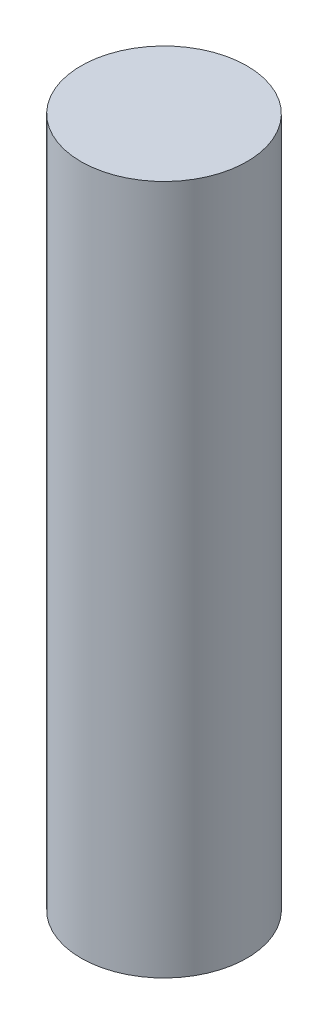
ISO-10303-21;
HEADER;
FILE_DESCRIPTION(('STEP AP214'),'2;1');
FILE_NAME('part.step','',(''),(''),'','','');
FILE_SCHEMA(('AUTOMOTIVE_DESIGN { 1 0 10303 214 1 1 1 1 }'));
ENDSEC;
DATA;
#1=APPLICATION_CONTEXT('core data for automotive mechanical design processes');
#2=APPLICATION_PROTOCOL_DEFINITION('international standard','automotive_design',2000,#1);
#3=PRODUCT_CONTEXT('',#1,'mechanical');
#4=PRODUCT('Part','Part','',(#3));
#5=PRODUCT_RELATED_PRODUCT_CATEGORY('part','',(#4));
#6=PRODUCT_DEFINITION_FORMATION('','',#4);
#7=PRODUCT_DEFINITION_CONTEXT('part definition',#1,'design');
#8=PRODUCT_DEFINITION('design','',#6,#7);
#9=PRODUCT_DEFINITION_SHAPE('','',#8);
#10=(LENGTH_UNIT() NAMED_UNIT(*) SI_UNIT(.MILLI.,.METRE.));
#11=(NAMED_UNIT(*) PLANE_ANGLE_UNIT() SI_UNIT($,.RADIAN.));
#12=(NAMED_UNIT(*) SI_UNIT($,.STERADIAN.) SOLID_ANGLE_UNIT());
#13=UNCERTAINTY_MEASURE_WITH_UNIT(LENGTH_MEASURE(1.E-05),#10,'distance_accuracy_value','');
#14=(GEOMETRIC_REPRESENTATION_CONTEXT(3) GLOBAL_UNCERTAINTY_ASSIGNED_CONTEXT((#13)) GLOBAL_UNIT_ASSIGNED_CONTEXT((#10,
#11,#12)) REPRESENTATION_CONTEXT('',''));
#15=CARTESIAN_POINT('',(0.,0.,0.));
#16=DIRECTION('',(0.,0.,1.));
#17=DIRECTION('',(1.,0.,0.));
#18=AXIS2_PLACEMENT_3D('',#15,#16,#17);
#19=CARTESIAN_POINT('',(0.,16.,0.));
#20=DIRECTION('',(0.,-1.,0.));
#21=DIRECTION('',(0.,0.,-1.));
#22=AXIS2_PLACEMENT_3D('',#19,#20,#21);
#23=CYLINDRICAL_SURFACE('',#22,3.85);
#24=CARTESIAN_POINT('',(0.,16.,0.));
#25=DIRECTION('',(0.,1.,0.));
#26=DIRECTION('',(0.,0.,1.));
#27=AXIS2_PLACEMENT_3D('',#24,#25,#26);
#28=CIRCLE('',#27,3.85);
#29=CARTESIAN_POINT('',(0.,16.,3.85));
#30=VERTEX_POINT('',#29);
#31=EDGE_CURVE('E10',#30,#30,#28,.T.);
#32=ORIENTED_EDGE('',*,*,#31,.F.);
#33=EDGE_LOOP('',(#32));
#34=FACE_BOUND('',#33,.T.);
#35=CARTESIAN_POINT('',(0.,-16.,0.));
#36=DIRECTION('',(0.,1.,0.));
#37=DIRECTION('',(0.,0.,1.));
#38=AXIS2_PLACEMENT_3D('',#35,#36,#37);
#39=CIRCLE('',#38,3.85);
#40=CARTESIAN_POINT('',(0.,-16.,3.85));
#41=VERTEX_POINT('',#40);
#42=EDGE_CURVE('E46',#41,#41,#39,.T.);
#43=ORIENTED_EDGE('',*,*,#42,.T.);
#44=EDGE_LOOP('',(#43));
#45=FACE_BOUND('',#44,.T.);
#46=ADVANCED_FACE('F43',(#34,#45),#23,.T.);
#47=CARTESIAN_POINT('',(0.,16.,0.));
#48=DIRECTION('',(0.,1.,0.));
#49=DIRECTION('',(0.,0.,1.));
#50=AXIS2_PLACEMENT_3D('',#47,#48,#49);
#51=PLANE('',#50);
#52=ORIENTED_EDGE('',*,*,#31,.T.);
#53=EDGE_LOOP('',(#52));
#54=FACE_BOUND('',#53,.T.);
#55=ADVANCED_FACE('F60',(#54),#51,.T.);
#56=CARTESIAN_POINT('',(0.,-16.,0.));
#57=DIRECTION('',(0.,1.,0.));
#58=DIRECTION('',(0.,0.,1.));
#59=AXIS2_PLACEMENT_3D('',#56,#57,#58);
#60=PLANE('',#59);
#61=ORIENTED_EDGE('',*,*,#42,.F.);
#62=EDGE_LOOP('',(#61));
#63=FACE_BOUND('',#62,.T.);
#64=ADVANCED_FACE('F58',(#63),#60,.F.);
#65=CLOSED_SHELL('',(#46,#55,#64));
#66=MANIFOLD_SOLID_BREP('B2',#65);
#67=ADVANCED_BREP_SHAPE_REPRESENTATION('',(#18,#66),#14);
#68=SHAPE_DEFINITION_REPRESENTATION(#9,#67);
ENDSEC;
END-ISO-10303-21;
